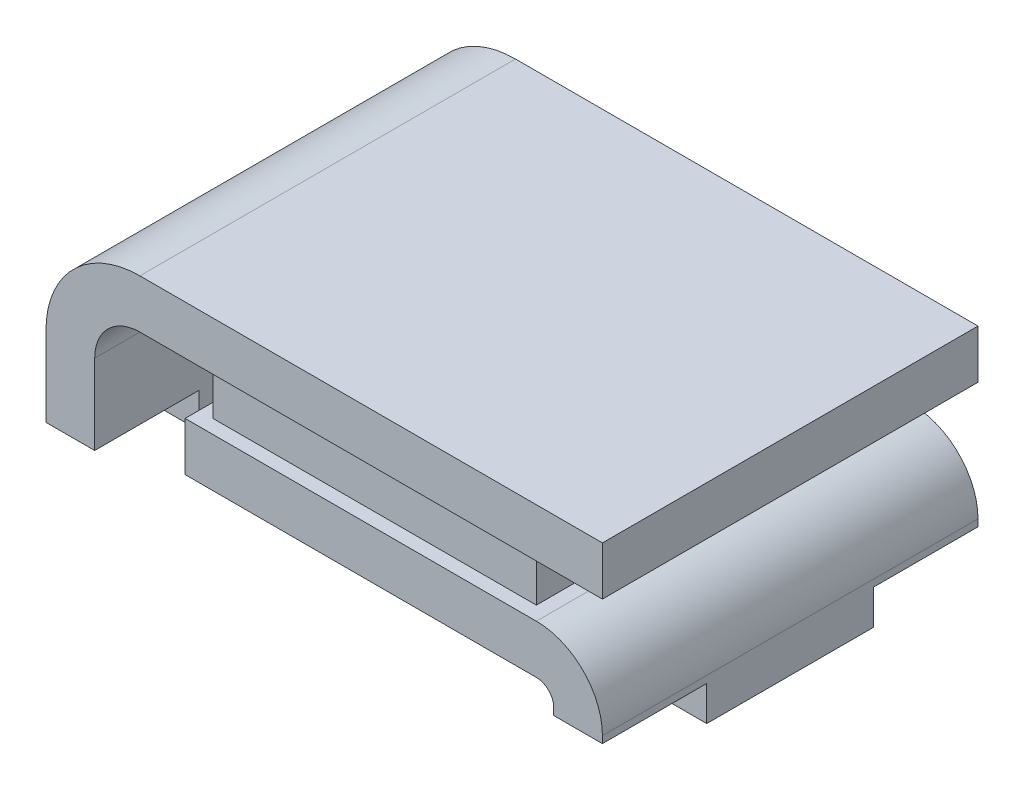
ISO-10303-21;
HEADER;
FILE_DESCRIPTION(('STEP AP214'),'2;1');
FILE_NAME('part.step','',(''),(''),'','','');
FILE_SCHEMA(('AUTOMOTIVE_DESIGN { 1 0 10303 214 1 1 1 1 }'));
ENDSEC;
DATA;
#1=APPLICATION_CONTEXT('core data for automotive mechanical design processes');
#2=APPLICATION_PROTOCOL_DEFINITION('international standard','automotive_design',2000,#1);
#3=PRODUCT_CONTEXT('',#1,'mechanical');
#4=PRODUCT('Part','Part','',(#3));
#5=PRODUCT_RELATED_PRODUCT_CATEGORY('part','',(#4));
#6=PRODUCT_DEFINITION_FORMATION('','',#4);
#7=PRODUCT_DEFINITION_CONTEXT('part definition',#1,'design');
#8=PRODUCT_DEFINITION('design','',#6,#7);
#9=PRODUCT_DEFINITION_SHAPE('','',#8);
#10=(LENGTH_UNIT() NAMED_UNIT(*) SI_UNIT(.MILLI.,.METRE.));
#11=(NAMED_UNIT(*) PLANE_ANGLE_UNIT() SI_UNIT($,.RADIAN.));
#12=(NAMED_UNIT(*) SI_UNIT($,.STERADIAN.) SOLID_ANGLE_UNIT());
#13=UNCERTAINTY_MEASURE_WITH_UNIT(LENGTH_MEASURE(1.E-05),#10,'distance_accuracy_value','');
#14=(GEOMETRIC_REPRESENTATION_CONTEXT(3) GLOBAL_UNCERTAINTY_ASSIGNED_CONTEXT((#13)) GLOBAL_UNIT_ASSIGNED_CONTEXT((#10,
#11,#12)) REPRESENTATION_CONTEXT('',''));
#15=CARTESIAN_POINT('',(0.,0.,0.));
#16=DIRECTION('',(0.,0.,1.));
#17=DIRECTION('',(1.,0.,0.));
#18=AXIS2_PLACEMENT_3D('',#15,#16,#17);
#19=CARTESIAN_POINT('',(3.3,0.6,2.7));
#20=DIRECTION('',(1.,0.,0.));
#21=DIRECTION('',(0.,0.,-1.));
#22=AXIS2_PLACEMENT_3D('',#19,#20,#21);
#23=PLANE('',#22);
#24=DIRECTION('',(0.,0.,1.));
#25=VECTOR('',#24,1.);
#26=CARTESIAN_POINT('',(3.3,0.5,2.8));
#27=LINE('',#26,#25);
#28=CARTESIAN_POINT('',(3.3,0.5,1.2));
#29=VERTEX_POINT('',#28);
#30=CARTESIAN_POINT('',(3.3,0.5,2.7));
#31=VERTEX_POINT('',#30);
#32=EDGE_CURVE('E256',#29,#31,#27,.T.);
#33=ORIENTED_EDGE('',*,*,#32,.T.);
#34=DIRECTION('',(0.,1.,0.));
#35=VECTOR('',#34,1.);
#36=CARTESIAN_POINT('',(3.3,0.6,2.7));
#37=LINE('',#36,#35);
#38=CARTESIAN_POINT('',(3.3,0.6,2.7));
#39=VERTEX_POINT('',#38);
#40=EDGE_CURVE('E202',#31,#39,#37,.T.);
#41=ORIENTED_EDGE('',*,*,#40,.T.);
#42=DIRECTION('',(0.,0.,1.));
#43=VECTOR('',#42,1.);
#44=CARTESIAN_POINT('',(3.3,0.6,0.));
#45=LINE('',#44,#43);
#46=CARTESIAN_POINT('',(3.3,0.6,-2.7));
#47=VERTEX_POINT('',#46);
#48=EDGE_CURVE('E197',#39,#47,#45,.F.);
#49=ORIENTED_EDGE('',*,*,#48,.T.);
#50=DIRECTION('',(0.,1.,0.));
#51=VECTOR('',#50,1.);
#52=CARTESIAN_POINT('',(3.3,0.6,-2.7));
#53=LINE('',#52,#51);
#54=CARTESIAN_POINT('',(3.3,0.5,-2.7));
#55=VERTEX_POINT('',#54);
#56=EDGE_CURVE('E199',#47,#55,#53,.F.);
#57=ORIENTED_EDGE('',*,*,#56,.T.);
#58=DIRECTION('',(0.,0.,1.));
#59=VECTOR('',#58,1.);
#60=CARTESIAN_POINT('',(3.3,0.5,-1.2));
#61=LINE('',#60,#59);
#62=CARTESIAN_POINT('',(3.3,0.5,-1.2));
#63=VERTEX_POINT('',#62);
#64=EDGE_CURVE('E297',#55,#63,#61,.T.);
#65=ORIENTED_EDGE('',*,*,#64,.T.);
#66=DIRECTION('',(0.,1.,0.));
#67=VECTOR('',#66,1.);
#68=CARTESIAN_POINT('',(3.3,-0.1,-1.2));
#69=LINE('',#68,#67);
#70=CARTESIAN_POINT('',(3.3,0.,-1.2));
#71=VERTEX_POINT('',#70);
#72=EDGE_CURVE('E285',#63,#71,#69,.F.);
#73=ORIENTED_EDGE('',*,*,#72,.T.);
#74=DIRECTION('',(0.,0.,1.));
#75=VECTOR('',#74,1.);
#76=CARTESIAN_POINT('',(3.3,0.,0.));
#77=LINE('',#76,#75);
#78=CARTESIAN_POINT('',(3.3,0.,1.2));
#79=VERTEX_POINT('',#78);
#80=EDGE_CURVE('E276',#71,#79,#77,.T.);
#81=ORIENTED_EDGE('',*,*,#80,.T.);
#82=DIRECTION('',(0.,1.,0.));
#83=VECTOR('',#82,1.);
#84=CARTESIAN_POINT('',(3.3,0.5,1.2));
#85=LINE('',#84,#83);
#86=EDGE_CURVE('E266',#79,#29,#85,.T.);
#87=ORIENTED_EDGE('',*,*,#86,.T.);
#88=EDGE_LOOP('',(#33,#41,#49,#57,#65,#73,#81,#87));
#89=FACE_BOUND('',#88,.T.);
#90=ADVANCED_FACE('F16',(#89),#23,.F.);
#91=CARTESIAN_POINT('',(-4.,0.5,-1.2));
#92=DIRECTION('',(0.,1.,0.));
#93=DIRECTION('',(0.,0.,1.));
#94=AXIS2_PLACEMENT_3D('',#91,#92,#93);
#95=PLANE('',#94);
#96=DIRECTION('',(0.,0.,1.));
#97=VECTOR('',#96,1.);
#98=CARTESIAN_POINT('',(4.,0.5,2.7));
#99=LINE('',#98,#97);
#100=CARTESIAN_POINT('',(4.,0.5,-2.7));
#101=VERTEX_POINT('',#100);
#102=CARTESIAN_POINT('',(4.,0.5,-1.2));
#103=VERTEX_POINT('',#102);
#104=EDGE_CURVE('E239',#101,#103,#99,.T.);
#105=ORIENTED_EDGE('',*,*,#104,.T.);
#106=DIRECTION('',(1.,0.,0.));
#107=VECTOR('',#106,1.);
#108=CARTESIAN_POINT('',(-4.,0.5,-1.2));
#109=LINE('',#108,#107);
#110=EDGE_CURVE('E277',#103,#63,#109,.F.);
#111=ORIENTED_EDGE('',*,*,#110,.T.);
#112=ORIENTED_EDGE('',*,*,#64,.F.);
#113=DIRECTION('',(1.,0.,0.));
#114=VECTOR('',#113,1.);
#115=CARTESIAN_POINT('',(4.,0.5,-2.7));
#116=LINE('',#115,#114);
#117=EDGE_CURVE('E215',#55,#101,#116,.T.);
#118=ORIENTED_EDGE('',*,*,#117,.T.);
#119=EDGE_LOOP('',(#105,#111,#112,#118));
#120=FACE_BOUND('',#119,.T.);
#121=ADVANCED_FACE('F649',(#120),#95,.F.);
#122=CARTESIAN_POINT('',(-4.,-0.1,-1.2));
#123=DIRECTION('',(0.,0.,1.));
#124=DIRECTION('',(1.,0.,0.));
#125=AXIS2_PLACEMENT_3D('',#122,#123,#124);
#126=PLANE('',#125);
#127=DIRECTION('',(0.,1.,0.));
#128=VECTOR('',#127,1.);
#129=CARTESIAN_POINT('',(4.,0.6,-1.2));
#130=LINE('',#129,#128);
#131=CARTESIAN_POINT('',(4.,0.,-1.2));
#132=VERTEX_POINT('',#131);
#133=EDGE_CURVE('E270',#103,#132,#130,.F.);
#134=ORIENTED_EDGE('',*,*,#133,.T.);
#135=DIRECTION('',(1.,0.,0.));
#136=VECTOR('',#135,1.);
#137=CARTESIAN_POINT('',(0.,0.,-1.2));
#138=LINE('',#137,#136);
#139=EDGE_CURVE('E273',#132,#71,#138,.F.);
#140=ORIENTED_EDGE('',*,*,#139,.T.);
#141=ORIENTED_EDGE('',*,*,#72,.F.);
#142=ORIENTED_EDGE('',*,*,#110,.F.);
#143=EDGE_LOOP('',(#134,#140,#141,#142));
#144=FACE_BOUND('',#143,.T.);
#145=ADVANCED_FACE('F646',(#144),#126,.F.);
#146=CARTESIAN_POINT('',(0.,0.,0.));
#147=DIRECTION('',(0.,1.,0.));
#148=DIRECTION('',(0.,0.,1.));
#149=AXIS2_PLACEMENT_3D('',#146,#147,#148);
#150=PLANE('',#149);
#151=DIRECTION('',(-1.,0.,0.));
#152=VECTOR('',#151,1.);
#153=CARTESIAN_POINT('',(-4.,0.,1.2));
#154=LINE('',#153,#152);
#155=CARTESIAN_POINT('',(4.,0.,1.2));
#156=VERTEX_POINT('',#155);
#157=EDGE_CURVE('E263',#156,#79,#154,.T.);
#158=ORIENTED_EDGE('',*,*,#157,.T.);
#159=ORIENTED_EDGE('',*,*,#80,.F.);
#160=ORIENTED_EDGE('',*,*,#139,.F.);
#161=DIRECTION('',(0.,0.,1.));
#162=VECTOR('',#161,1.);
#163=CARTESIAN_POINT('',(4.,0.,2.7));
#164=LINE('',#163,#162);
#165=EDGE_CURVE('E260',#132,#156,#164,.T.);
#166=ORIENTED_EDGE('',*,*,#165,.T.);
#167=EDGE_LOOP('',(#158,#159,#160,#166));
#168=FACE_BOUND('',#167,.T.);
#169=ADVANCED_FACE('F642',(#168),#150,.F.);
#170=CARTESIAN_POINT('',(-4.,0.5,1.2));
#171=DIRECTION('',(0.,0.,-1.));
#172=DIRECTION('',(-1.,0.,0.));
#173=AXIS2_PLACEMENT_3D('',#170,#171,#172);
#174=PLANE('',#173);
#175=DIRECTION('',(0.,1.,0.));
#176=VECTOR('',#175,1.);
#177=CARTESIAN_POINT('',(4.,0.6,1.2));
#178=LINE('',#177,#176);
#179=CARTESIAN_POINT('',(4.,0.5,1.2));
#180=VERTEX_POINT('',#179);
#181=EDGE_CURVE('E230',#156,#180,#178,.T.);
#182=ORIENTED_EDGE('',*,*,#181,.T.);
#183=DIRECTION('',(1.,0.,0.));
#184=VECTOR('',#183,1.);
#185=CARTESIAN_POINT('',(-4.,0.5,1.2));
#186=LINE('',#185,#184);
#187=EDGE_CURVE('E216',#180,#29,#186,.F.);
#188=ORIENTED_EDGE('',*,*,#187,.T.);
#189=ORIENTED_EDGE('',*,*,#86,.F.);
#190=ORIENTED_EDGE('',*,*,#157,.F.);
#191=EDGE_LOOP('',(#182,#188,#189,#190));
#192=FACE_BOUND('',#191,.T.);
#193=ADVANCED_FACE('F638',(#192),#174,.F.);
#194=CARTESIAN_POINT('',(-4.,0.5,2.8));
#195=DIRECTION('',(0.,1.,0.));
#196=DIRECTION('',(0.,0.,1.));
#197=AXIS2_PLACEMENT_3D('',#194,#195,#196);
#198=PLANE('',#197);
#199=DIRECTION('',(0.,0.,1.));
#200=VECTOR('',#199,1.);
#201=CARTESIAN_POINT('',(4.,0.5,2.7));
#202=LINE('',#201,#200);
#203=CARTESIAN_POINT('',(4.,0.5,2.7));
#204=VERTEX_POINT('',#203);
#205=EDGE_CURVE('E224',#180,#204,#202,.T.);
#206=ORIENTED_EDGE('',*,*,#205,.T.);
#207=DIRECTION('',(-1.,0.,0.));
#208=VECTOR('',#207,1.);
#209=CARTESIAN_POINT('',(4.,0.5,2.7));
#210=LINE('',#209,#208);
#211=EDGE_CURVE('E243',#204,#31,#210,.T.);
#212=ORIENTED_EDGE('',*,*,#211,.T.);
#213=ORIENTED_EDGE('',*,*,#32,.F.);
#214=ORIENTED_EDGE('',*,*,#187,.F.);
#215=EDGE_LOOP('',(#206,#212,#213,#214));
#216=FACE_BOUND('',#215,.T.);
#217=ADVANCED_FACE('F635',(#216),#198,.F.);
#218=CARTESIAN_POINT('',(3.05,0.6,0.));
#219=DIRECTION('',(0.,0.,1.));
#220=DIRECTION('',(1.,0.,0.));
#221=AXIS2_PLACEMENT_3D('',#218,#219,#220);
#222=CYLINDRICAL_SURFACE('',#221,0.25);
#223=DIRECTION('',(0.,0.,1.));
#224=VECTOR('',#223,1.);
#225=CARTESIAN_POINT('',(3.05,0.85,2.7));
#226=LINE('',#225,#224);
#227=CARTESIAN_POINT('',(3.05,0.85,-2.7));
#228=VERTEX_POINT('',#227);
#229=CARTESIAN_POINT('',(3.05,0.85,2.7));
#230=VERTEX_POINT('',#229);
#231=EDGE_CURVE('E221',#228,#230,#226,.T.);
#232=ORIENTED_EDGE('',*,*,#231,.F.);
#233=CARTESIAN_POINT('',(3.05,0.6,-2.7));
#234=DIRECTION('',(0.,0.,1.));
#235=DIRECTION('',(1.,0.,0.));
#236=AXIS2_PLACEMENT_3D('',#233,#234,#235);
#237=CIRCLE('',#236,0.25);
#238=EDGE_CURVE('E19',#47,#228,#237,.T.);
#239=ORIENTED_EDGE('',*,*,#238,.F.);
#240=ORIENTED_EDGE('',*,*,#48,.F.);
#241=CARTESIAN_POINT('',(3.05,0.6,2.7));
#242=DIRECTION('',(0.,0.,1.));
#243=DIRECTION('',(1.,0.,0.));
#244=AXIS2_PLACEMENT_3D('',#241,#242,#243);
#245=CIRCLE('',#244,0.25);
#246=EDGE_CURVE('E222',#230,#39,#245,.F.);
#247=ORIENTED_EDGE('',*,*,#246,.F.);
#248=EDGE_LOOP('',(#232,#239,#240,#247));
#249=FACE_BOUND('',#248,.T.);
#250=ADVANCED_FACE('F219',(#249),#222,.F.);
#251=CARTESIAN_POINT('',(4.,0.6,2.7));
#252=DIRECTION('',(-1.,0.,0.));
#253=DIRECTION('',(0.,0.,1.));
#254=AXIS2_PLACEMENT_3D('',#251,#252,#253);
#255=PLANE('',#254);
#256=ORIENTED_EDGE('',*,*,#205,.F.);
#257=ORIENTED_EDGE('',*,*,#181,.F.);
#258=ORIENTED_EDGE('',*,*,#165,.F.);
#259=ORIENTED_EDGE('',*,*,#133,.F.);
#260=ORIENTED_EDGE('',*,*,#104,.F.);
#261=DIRECTION('',(0.,1.,0.));
#262=VECTOR('',#261,1.);
#263=CARTESIAN_POINT('',(4.,0.6,-2.7));
#264=LINE('',#263,#262);
#265=CARTESIAN_POINT('',(4.,0.6,-2.7));
#266=VERTEX_POINT('',#265);
#267=EDGE_CURVE('E206',#266,#101,#264,.F.);
#268=ORIENTED_EDGE('',*,*,#267,.F.);
#269=DIRECTION('',(0.,0.,1.));
#270=VECTOR('',#269,1.);
#271=CARTESIAN_POINT('',(4.,0.6,0.));
#272=LINE('',#271,#270);
#273=CARTESIAN_POINT('',(4.,0.6,2.7));
#274=VERTEX_POINT('',#273);
#275=EDGE_CURVE('E234',#274,#266,#272,.F.);
#276=ORIENTED_EDGE('',*,*,#275,.F.);
#277=DIRECTION('',(0.,1.,0.));
#278=VECTOR('',#277,1.);
#279=CARTESIAN_POINT('',(4.,0.6,2.7));
#280=LINE('',#279,#278);
#281=EDGE_CURVE('E223',#204,#274,#280,.T.);
#282=ORIENTED_EDGE('',*,*,#281,.F.);
#283=EDGE_LOOP('',(#256,#257,#258,#259,#260,#268,#276,#282));
#284=FACE_BOUND('',#283,.T.);
#285=ADVANCED_FACE('F626',(#284),#255,.F.);
#286=CARTESIAN_POINT('',(3.05,0.85,2.7));
#287=DIRECTION('',(0.,-1.,0.));
#288=DIRECTION('',(1.,0.,0.));
#289=AXIS2_PLACEMENT_3D('',#286,#287,#288);
#290=PLANE('',#289);
#291=DIRECTION('',(0.,0.,1.));
#292=VECTOR('',#291,1.);
#293=CARTESIAN_POINT('',(-2.00000000000005,0.85,0.));
#294=LINE('',#293,#292);
#295=CARTESIAN_POINT('',(-2.00000000000001,0.85,-2.7));
#296=VERTEX_POINT('',#295);
#297=CARTESIAN_POINT('',(-2.00000000000002,0.85,2.7));
#298=VERTEX_POINT('',#297);
#299=EDGE_CURVE('E341',#296,#298,#294,.T.);
#300=ORIENTED_EDGE('',*,*,#299,.F.);
#301=DIRECTION('',(1.,0.,0.));
#302=VECTOR('',#301,1.);
#303=CARTESIAN_POINT('',(3.05,0.85,-2.7));
#304=LINE('',#303,#302);
#305=EDGE_CURVE('E328',#228,#296,#304,.F.);
#306=ORIENTED_EDGE('',*,*,#305,.F.);
#307=ORIENTED_EDGE('',*,*,#231,.T.);
#308=DIRECTION('',(1.,0.,0.));
#309=VECTOR('',#308,1.);
#310=CARTESIAN_POINT('',(3.05,0.85,2.7));
#311=LINE('',#310,#309);
#312=EDGE_CURVE('E343',#298,#230,#311,.T.);
#313=ORIENTED_EDGE('',*,*,#312,.F.);
#314=EDGE_LOOP('',(#300,#306,#307,#313));
#315=FACE_BOUND('',#314,.T.);
#316=ADVANCED_FACE('F619',(#315),#290,.T.);
#317=CARTESIAN_POINT('',(3.05,0.6,0.));
#318=DIRECTION('',(0.,0.,1.));
#319=DIRECTION('',(1.,0.,0.));
#320=AXIS2_PLACEMENT_3D('',#317,#318,#319);
#321=CYLINDRICAL_SURFACE('',#320,0.95);
#322=DIRECTION('',(0.,0.,1.));
#323=VECTOR('',#322,1.);
#324=CARTESIAN_POINT('',(3.05,1.55,2.7));
#325=LINE('',#324,#323);
#326=CARTESIAN_POINT('',(3.05,1.55,2.7));
#327=VERTEX_POINT('',#326);
#328=CARTESIAN_POINT('',(3.05,1.55,-2.7));
#329=VERTEX_POINT('',#328);
#330=EDGE_CURVE('E345',#327,#329,#325,.F.);
#331=ORIENTED_EDGE('',*,*,#330,.F.);
#332=CARTESIAN_POINT('',(3.05,0.6,2.7));
#333=DIRECTION('',(0.,0.,1.));
#334=DIRECTION('',(1.,0.,0.));
#335=AXIS2_PLACEMENT_3D('',#332,#333,#334);
#336=CIRCLE('',#335,0.95);
#337=EDGE_CURVE('E325',#327,#274,#336,.F.);
#338=ORIENTED_EDGE('',*,*,#337,.T.);
#339=ORIENTED_EDGE('',*,*,#275,.T.);
#340=CARTESIAN_POINT('',(3.05,0.6,-2.7));
#341=DIRECTION('',(0.,0.,1.));
#342=DIRECTION('',(1.,0.,0.));
#343=AXIS2_PLACEMENT_3D('',#340,#341,#342);
#344=CIRCLE('',#343,0.95);
#345=EDGE_CURVE('E329',#266,#329,#344,.T.);
#346=ORIENTED_EDGE('',*,*,#345,.T.);
#347=EDGE_LOOP('',(#331,#338,#339,#346));
#348=FACE_BOUND('',#347,.T.);
#349=ADVANCED_FACE('F617',(#348),#321,.T.);
#350=CARTESIAN_POINT('',(3.05,1.55,-2.7));
#351=DIRECTION('',(0.,0.,-1.));
#352=DIRECTION('',(0.,1.,0.));
#353=AXIS2_PLACEMENT_3D('',#350,#351,#352);
#354=PLANE('',#353);
#355=DIRECTION('',(0.,-1.,0.));
#356=VECTOR('',#355,1.);
#357=CARTESIAN_POINT('',(-2.,-2.45,-2.7));
#358=LINE('',#357,#356);
#359=CARTESIAN_POINT('',(-2.00000000000001,1.55,-2.7));
#360=VERTEX_POINT('',#359);
#361=EDGE_CURVE('E357',#360,#296,#358,.T.);
#362=ORIENTED_EDGE('',*,*,#361,.F.);
#363=DIRECTION('',(-1.,0.,0.));
#364=VECTOR('',#363,1.);
#365=CARTESIAN_POINT('',(3.05,1.55,-2.7));
#366=LINE('',#365,#364);
#367=EDGE_CURVE('E349',#329,#360,#366,.T.);
#368=ORIENTED_EDGE('',*,*,#367,.F.);
#369=ORIENTED_EDGE('',*,*,#345,.F.);
#370=ORIENTED_EDGE('',*,*,#267,.T.);
#371=ORIENTED_EDGE('',*,*,#117,.F.);
#372=ORIENTED_EDGE('',*,*,#56,.F.);
#373=ORIENTED_EDGE('',*,*,#238,.T.);
#374=ORIENTED_EDGE('',*,*,#305,.T.);
#375=EDGE_LOOP('',(#362,#368,#369,#370,#371,#372,#373,#374));
#376=FACE_BOUND('',#375,.T.);
#377=ADVANCED_FACE('F211',(#376),#354,.T.);
#378=CARTESIAN_POINT('',(-2.,-2.45,0.));
#379=DIRECTION('',(-1.,0.,0.));
#380=DIRECTION('',(0.,-1.,0.));
#381=AXIS2_PLACEMENT_3D('',#378,#379,#380);
#382=PLANE('',#381);
#383=DIRECTION('',(0.,0.,1.));
#384=VECTOR('',#383,1.);
#385=CARTESIAN_POINT('',(-2.,1.55,2.7));
#386=LINE('',#385,#384);
#387=CARTESIAN_POINT('',(-2.00000000000003,1.55,2.7));
#388=VERTEX_POINT('',#387);
#389=EDGE_CURVE('E354',#360,#388,#386,.T.);
#390=ORIENTED_EDGE('',*,*,#389,.F.);
#391=ORIENTED_EDGE('',*,*,#361,.T.);
#392=ORIENTED_EDGE('',*,*,#299,.T.);
#393=DIRECTION('',(0.,1.,0.));
#394=VECTOR('',#393,1.);
#395=CARTESIAN_POINT('',(-2.,1.55,2.7));
#396=LINE('',#395,#394);
#397=EDGE_CURVE('E346',#388,#298,#396,.F.);
#398=ORIENTED_EDGE('',*,*,#397,.F.);
#399=EDGE_LOOP('',(#390,#391,#392,#398));
#400=FACE_BOUND('',#399,.T.);
#401=ADVANCED_FACE('F615',(#400),#382,.T.);
#402=CARTESIAN_POINT('',(3.05,1.55,2.7));
#403=DIRECTION('',(0.,0.,1.));
#404=DIRECTION('',(1.,0.,0.));
#405=AXIS2_PLACEMENT_3D('',#402,#403,#404);
#406=PLANE('',#405);
#407=ORIENTED_EDGE('',*,*,#397,.T.);
#408=ORIENTED_EDGE('',*,*,#312,.T.);
#409=ORIENTED_EDGE('',*,*,#246,.T.);
#410=ORIENTED_EDGE('',*,*,#40,.F.);
#411=ORIENTED_EDGE('',*,*,#211,.F.);
#412=ORIENTED_EDGE('',*,*,#281,.T.);
#413=ORIENTED_EDGE('',*,*,#337,.F.);
#414=DIRECTION('',(-1.,0.,0.));
#415=VECTOR('',#414,1.);
#416=CARTESIAN_POINT('',(3.05,1.55,2.7));
#417=LINE('',#416,#415);
#418=EDGE_CURVE('E350',#388,#327,#417,.F.);
#419=ORIENTED_EDGE('',*,*,#418,.F.);
#420=EDGE_LOOP('',(#407,#408,#409,#410,#411,#412,#413,#419));
#421=FACE_BOUND('',#420,.T.);
#422=ADVANCED_FACE('F616',(#421),#406,.T.);
#423=CARTESIAN_POINT('',(-3.3,1.65,2.7));
#424=DIRECTION('',(-1.,0.,0.));
#425=DIRECTION('',(0.,0.,1.));
#426=AXIS2_PLACEMENT_3D('',#423,#424,#425);
#427=PLANE('',#426);
#428=DIRECTION('',(0.,0.,1.));
#429=VECTOR('',#428,1.);
#430=CARTESIAN_POINT('',(-3.3,0.5,2.8));
#431=LINE('',#430,#429);
#432=CARTESIAN_POINT('',(-3.3,0.5,2.7));
#433=VERTEX_POINT('',#432);
#434=CARTESIAN_POINT('',(-3.3,0.5,1.2));
#435=VERTEX_POINT('',#434);
#436=EDGE_CURVE('E379',#433,#435,#431,.F.);
#437=ORIENTED_EDGE('',*,*,#436,.T.);
#438=DIRECTION('',(0.,1.,0.));
#439=VECTOR('',#438,1.);
#440=CARTESIAN_POINT('',(-3.3,0.5,1.2));
#441=LINE('',#440,#439);
#442=CARTESIAN_POINT('',(-3.3,0.,1.2));
#443=VERTEX_POINT('',#442);
#444=EDGE_CURVE('E377',#435,#443,#441,.F.);
#445=ORIENTED_EDGE('',*,*,#444,.T.);
#446=DIRECTION('',(0.,0.,1.));
#447=VECTOR('',#446,1.);
#448=CARTESIAN_POINT('',(-3.3,0.,0.));
#449=LINE('',#448,#447);
#450=CARTESIAN_POINT('',(-3.3,0.,-1.2));
#451=VERTEX_POINT('',#450);
#452=EDGE_CURVE('E353',#443,#451,#449,.F.);
#453=ORIENTED_EDGE('',*,*,#452,.T.);
#454=DIRECTION('',(0.,1.,0.));
#455=VECTOR('',#454,1.);
#456=CARTESIAN_POINT('',(-3.3,-0.1,-1.2));
#457=LINE('',#456,#455);
#458=CARTESIAN_POINT('',(-3.3,0.5,-1.2));
#459=VERTEX_POINT('',#458);
#460=EDGE_CURVE('E365',#451,#459,#457,.T.);
#461=ORIENTED_EDGE('',*,*,#460,.T.);
#462=DIRECTION('',(0.,0.,1.));
#463=VECTOR('',#462,1.);
#464=CARTESIAN_POINT('',(-3.3,0.5,-1.2));
#465=LINE('',#464,#463);
#466=CARTESIAN_POINT('',(-3.3,0.5,-2.7));
#467=VERTEX_POINT('',#466);
#468=EDGE_CURVE('E389',#459,#467,#465,.F.);
#469=ORIENTED_EDGE('',*,*,#468,.T.);
#470=DIRECTION('',(0.,1.,0.));
#471=VECTOR('',#470,1.);
#472=CARTESIAN_POINT('',(-3.3,1.65,-2.7));
#473=LINE('',#472,#471);
#474=CARTESIAN_POINT('',(-3.3,1.65,-2.7));
#475=VERTEX_POINT('',#474);
#476=EDGE_CURVE('E428',#467,#475,#473,.T.);
#477=ORIENTED_EDGE('',*,*,#476,.T.);
#478=DIRECTION('',(0.,0.,-1.));
#479=VECTOR('',#478,1.);
#480=CARTESIAN_POINT('',(-3.3,1.65,0.));
#481=LINE('',#480,#479);
#482=CARTESIAN_POINT('',(-3.3,1.65,2.7));
#483=VERTEX_POINT('',#482);
#484=EDGE_CURVE('E445',#475,#483,#481,.F.);
#485=ORIENTED_EDGE('',*,*,#484,.T.);
#486=DIRECTION('',(0.,1.,0.));
#487=VECTOR('',#486,1.);
#488=CARTESIAN_POINT('',(-3.3,1.65,2.7));
#489=LINE('',#488,#487);
#490=EDGE_CURVE('E373',#483,#433,#489,.F.);
#491=ORIENTED_EDGE('',*,*,#490,.T.);
#492=EDGE_LOOP('',(#437,#445,#453,#461,#469,#477,#485,#491));
#493=FACE_BOUND('',#492,.T.);
#494=ADVANCED_FACE('F539',(#493),#427,.F.);
#495=CARTESIAN_POINT('',(3.05,1.55,2.7));
#496=DIRECTION('',(0.,1.,0.));
#497=DIRECTION('',(-1.,0.,0.));
#498=AXIS2_PLACEMENT_3D('',#495,#496,#497);
#499=PLANE('',#498);
#500=DIRECTION('',(1.,0.,0.));
#501=VECTOR('',#500,1.);
#502=CARTESIAN_POINT('',(-1.8,1.55,-2.5));
#503=LINE('',#502,#501);
#504=CARTESIAN_POINT('',(-1.8,1.55,-2.5));
#505=VERTEX_POINT('',#504);
#506=CARTESIAN_POINT('',(2.85,1.55,-2.5));
#507=VERTEX_POINT('',#506);
#508=EDGE_CURVE('E464',#505,#507,#503,.T.);
#509=ORIENTED_EDGE('',*,*,#508,.T.);
#510=DIRECTION('',(0.,0.,1.));
#511=VECTOR('',#510,1.);
#512=CARTESIAN_POINT('',(2.85,1.55,-2.5));
#513=LINE('',#512,#511);
#514=CARTESIAN_POINT('',(2.85,1.55,2.5));
#515=VERTEX_POINT('',#514);
#516=EDGE_CURVE('E460',#507,#515,#513,.T.);
#517=ORIENTED_EDGE('',*,*,#516,.T.);
#518=DIRECTION('',(-1.,0.,0.));
#519=VECTOR('',#518,1.);
#520=CARTESIAN_POINT('',(-1.8,1.55,2.5));
#521=LINE('',#520,#519);
#522=CARTESIAN_POINT('',(-1.8,1.55,2.5));
#523=VERTEX_POINT('',#522);
#524=EDGE_CURVE('E456',#515,#523,#521,.T.);
#525=ORIENTED_EDGE('',*,*,#524,.T.);
#526=DIRECTION('',(0.,0.,-1.));
#527=VECTOR('',#526,1.);
#528=CARTESIAN_POINT('',(-1.8,1.55,-2.5));
#529=LINE('',#528,#527);
#530=EDGE_CURVE('E447',#523,#505,#529,.T.);
#531=ORIENTED_EDGE('',*,*,#530,.T.);
#532=EDGE_LOOP('',(#509,#517,#525,#531));
#533=FACE_BOUND('',#532,.T.);
#534=ORIENTED_EDGE('',*,*,#389,.T.);
#535=ORIENTED_EDGE('',*,*,#418,.T.);
#536=ORIENTED_EDGE('',*,*,#330,.T.);
#537=ORIENTED_EDGE('',*,*,#367,.T.);
#538=EDGE_LOOP('',(#534,#535,#536,#537));
#539=FACE_BOUND('',#538,.T.);
#540=ADVANCED_FACE('F610',(#533,#539),#499,.T.);
#541=CARTESIAN_POINT('',(0.,0.,0.));
#542=DIRECTION('',(0.,1.,0.));
#543=DIRECTION('',(0.,0.,1.));
#544=AXIS2_PLACEMENT_3D('',#541,#542,#543);
#545=PLANE('',#544);
#546=DIRECTION('',(-1.,0.,0.));
#547=VECTOR('',#546,1.);
#548=CARTESIAN_POINT('',(-4.,0.,1.2));
#549=LINE('',#548,#547);
#550=CARTESIAN_POINT('',(-4.,0.,1.2));
#551=VERTEX_POINT('',#550);
#552=EDGE_CURVE('E374',#443,#551,#549,.T.);
#553=ORIENTED_EDGE('',*,*,#552,.T.);
#554=DIRECTION('',(0.,0.,-1.));
#555=VECTOR('',#554,1.);
#556=CARTESIAN_POINT('',(-4.,0.,2.7));
#557=LINE('',#556,#555);
#558=CARTESIAN_POINT('',(-4.,0.,-1.2));
#559=VERTEX_POINT('',#558);
#560=EDGE_CURVE('E403',#551,#559,#557,.T.);
#561=ORIENTED_EDGE('',*,*,#560,.T.);
#562=DIRECTION('',(1.,0.,0.));
#563=VECTOR('',#562,1.);
#564=CARTESIAN_POINT('',(-4.,0.,-1.2));
#565=LINE('',#564,#563);
#566=EDGE_CURVE('E367',#559,#451,#565,.T.);
#567=ORIENTED_EDGE('',*,*,#566,.T.);
#568=ORIENTED_EDGE('',*,*,#452,.F.);
#569=EDGE_LOOP('',(#553,#561,#567,#568));
#570=FACE_BOUND('',#569,.T.);
#571=ADVANCED_FACE('F541',(#570),#545,.F.);
#572=CARTESIAN_POINT('',(-4.,-0.1,-1.2));
#573=DIRECTION('',(0.,0.,1.));
#574=DIRECTION('',(1.,0.,0.));
#575=AXIS2_PLACEMENT_3D('',#572,#573,#574);
#576=PLANE('',#575);
#577=DIRECTION('',(0.,1.,0.));
#578=VECTOR('',#577,1.);
#579=CARTESIAN_POINT('',(-4.,1.65,-1.2));
#580=LINE('',#579,#578);
#581=CARTESIAN_POINT('',(-4.,0.5,-1.2));
#582=VERTEX_POINT('',#581);
#583=EDGE_CURVE('E405',#559,#582,#580,.T.);
#584=ORIENTED_EDGE('',*,*,#583,.T.);
#585=DIRECTION('',(1.,0.,0.));
#586=VECTOR('',#585,1.);
#587=CARTESIAN_POINT('',(-4.,0.5,-1.2));
#588=LINE('',#587,#586);
#589=EDGE_CURVE('E386',#582,#459,#588,.T.);
#590=ORIENTED_EDGE('',*,*,#589,.T.);
#591=ORIENTED_EDGE('',*,*,#460,.F.);
#592=ORIENTED_EDGE('',*,*,#566,.F.);
#593=EDGE_LOOP('',(#584,#590,#591,#592));
#594=FACE_BOUND('',#593,.T.);
#595=ADVANCED_FACE('F546',(#594),#576,.F.);
#596=CARTESIAN_POINT('',(-4.,0.5,-1.2));
#597=DIRECTION('',(0.,1.,0.));
#598=DIRECTION('',(0.,0.,1.));
#599=AXIS2_PLACEMENT_3D('',#596,#597,#598);
#600=PLANE('',#599);
#601=DIRECTION('',(0.,0.,-1.));
#602=VECTOR('',#601,1.);
#603=CARTESIAN_POINT('',(-4.,0.5,2.7));
#604=LINE('',#603,#602);
#605=CARTESIAN_POINT('',(-4.,0.5,-2.7));
#606=VERTEX_POINT('',#605);
#607=EDGE_CURVE('E414',#582,#606,#604,.T.);
#608=ORIENTED_EDGE('',*,*,#607,.T.);
#609=DIRECTION('',(1.,0.,0.));
#610=VECTOR('',#609,1.);
#611=CARTESIAN_POINT('',(-3.3,0.5,-2.7));
#612=LINE('',#611,#610);
#613=EDGE_CURVE('E425',#606,#467,#612,.T.);
#614=ORIENTED_EDGE('',*,*,#613,.T.);
#615=ORIENTED_EDGE('',*,*,#468,.F.);
#616=ORIENTED_EDGE('',*,*,#589,.F.);
#617=EDGE_LOOP('',(#608,#614,#615,#616));
#618=FACE_BOUND('',#617,.T.);
#619=ADVANCED_FACE('F552',(#618),#600,.F.);
#620=CARTESIAN_POINT('',(-4.,0.5,2.8));
#621=DIRECTION('',(0.,1.,0.));
#622=DIRECTION('',(0.,0.,1.));
#623=AXIS2_PLACEMENT_3D('',#620,#621,#622);
#624=PLANE('',#623);
#625=DIRECTION('',(-1.,0.,0.));
#626=VECTOR('',#625,1.);
#627=CARTESIAN_POINT('',(-4.,0.5,1.2));
#628=LINE('',#627,#626);
#629=CARTESIAN_POINT('',(-4.,0.5,1.2));
#630=VERTEX_POINT('',#629);
#631=EDGE_CURVE('E370',#630,#435,#628,.F.);
#632=ORIENTED_EDGE('',*,*,#631,.T.);
#633=ORIENTED_EDGE('',*,*,#436,.F.);
#634=DIRECTION('',(-1.,0.,0.));
#635=VECTOR('',#634,1.);
#636=CARTESIAN_POINT('',(-3.3,0.5,2.7));
#637=LINE('',#636,#635);
#638=CARTESIAN_POINT('',(-4.,0.5,2.7));
#639=VERTEX_POINT('',#638);
#640=EDGE_CURVE('E429',#433,#639,#637,.T.);
#641=ORIENTED_EDGE('',*,*,#640,.T.);
#642=DIRECTION('',(0.,0.,-1.));
#643=VECTOR('',#642,1.);
#644=CARTESIAN_POINT('',(-4.,0.5,2.7));
#645=LINE('',#644,#643);
#646=EDGE_CURVE('E400',#639,#630,#645,.T.);
#647=ORIENTED_EDGE('',*,*,#646,.T.);
#648=EDGE_LOOP('',(#632,#633,#641,#647));
#649=FACE_BOUND('',#648,.T.);
#650=ADVANCED_FACE('F531',(#649),#624,.F.);
#651=CARTESIAN_POINT('',(-4.,0.5,1.2));
#652=DIRECTION('',(0.,0.,-1.));
#653=DIRECTION('',(-1.,0.,0.));
#654=AXIS2_PLACEMENT_3D('',#651,#652,#653);
#655=PLANE('',#654);
#656=DIRECTION('',(0.,1.,0.));
#657=VECTOR('',#656,1.);
#658=CARTESIAN_POINT('',(-4.,1.65,1.2));
#659=LINE('',#658,#657);
#660=EDGE_CURVE('E324',#630,#551,#659,.F.);
#661=ORIENTED_EDGE('',*,*,#660,.T.);
#662=ORIENTED_EDGE('',*,*,#552,.F.);
#663=ORIENTED_EDGE('',*,*,#444,.F.);
#664=ORIENTED_EDGE('',*,*,#631,.F.);
#665=EDGE_LOOP('',(#661,#662,#663,#664));
#666=FACE_BOUND('',#665,.T.);
#667=ADVANCED_FACE('F535',(#666),#655,.F.);
#668=CARTESIAN_POINT('',(-2.65,1.65,0.));
#669=DIRECTION('',(0.,0.,-1.));
#670=DIRECTION('',(-1.,0.,0.));
#671=AXIS2_PLACEMENT_3D('',#668,#669,#670);
#672=CYLINDRICAL_SURFACE('',#671,0.65);
#673=DIRECTION('',(0.,0.,-1.));
#674=VECTOR('',#673,1.);
#675=CARTESIAN_POINT('',(-2.65,2.3,2.7));
#676=LINE('',#675,#674);
#677=CARTESIAN_POINT('',(-2.65,2.3,2.7));
#678=VERTEX_POINT('',#677);
#679=CARTESIAN_POINT('',(-2.65,2.3,-2.7));
#680=VERTEX_POINT('',#679);
#681=EDGE_CURVE('E320',#678,#680,#676,.T.);
#682=ORIENTED_EDGE('',*,*,#681,.F.);
#683=CARTESIAN_POINT('',(-2.65,1.65,2.7));
#684=DIRECTION('',(0.,0.,-1.));
#685=DIRECTION('',(-1.,0.,0.));
#686=AXIS2_PLACEMENT_3D('',#683,#684,#685);
#687=CIRCLE('',#686,0.65);
#688=EDGE_CURVE('E321',#483,#678,#687,.T.);
#689=ORIENTED_EDGE('',*,*,#688,.F.);
#690=ORIENTED_EDGE('',*,*,#484,.F.);
#691=CARTESIAN_POINT('',(-2.65,1.65,-2.7));
#692=DIRECTION('',(0.,0.,-1.));
#693=DIRECTION('',(-1.,0.,0.));
#694=AXIS2_PLACEMENT_3D('',#691,#692,#693);
#695=CIRCLE('',#694,0.65);
#696=EDGE_CURVE('E317',#680,#475,#695,.F.);
#697=ORIENTED_EDGE('',*,*,#696,.F.);
#698=EDGE_LOOP('',(#682,#689,#690,#697));
#699=FACE_BOUND('',#698,.T.);
#700=ADVANCED_FACE('F555',(#699),#672,.F.);
#701=CARTESIAN_POINT('',(-1.8,2.55,-2.5));
#702=DIRECTION('',(1.,0.,0.));
#703=DIRECTION('',(0.,0.,-1.));
#704=AXIS2_PLACEMENT_3D('',#701,#702,#703);
#705=PLANE('',#704);
#706=DIRECTION('',(0.,0.,-1.));
#707=VECTOR('',#706,1.);
#708=CARTESIAN_POINT('',(-1.8,2.3,2.7));
#709=LINE('',#708,#707);
#710=CARTESIAN_POINT('',(-1.8,2.3,-2.5));
#711=VERTEX_POINT('',#710);
#712=CARTESIAN_POINT('',(-1.8,2.3,2.5));
#713=VERTEX_POINT('',#712);
#714=EDGE_CURVE('E454',#711,#713,#709,.F.);
#715=ORIENTED_EDGE('',*,*,#714,.F.);
#716=DIRECTION('',(0.,1.,0.));
#717=VECTOR('',#716,1.);
#718=CARTESIAN_POINT('',(-1.8,2.55,-2.5));
#719=LINE('',#718,#717);
#720=EDGE_CURVE('E406',#711,#505,#719,.F.);
#721=ORIENTED_EDGE('',*,*,#720,.T.);
#722=ORIENTED_EDGE('',*,*,#530,.F.);
#723=DIRECTION('',(0.,1.,0.));
#724=VECTOR('',#723,1.);
#725=CARTESIAN_POINT('',(-1.8,2.55,2.5));
#726=LINE('',#725,#724);
#727=EDGE_CURVE('E458',#523,#713,#726,.T.);
#728=ORIENTED_EDGE('',*,*,#727,.T.);
#729=EDGE_LOOP('',(#715,#721,#722,#728));
#730=FACE_BOUND('',#729,.T.);
#731=ADVANCED_FACE('F557',(#730),#705,.F.);
#732=CARTESIAN_POINT('',(-1.8,2.55,2.5));
#733=DIRECTION('',(0.,0.,-1.));
#734=DIRECTION('',(-1.,0.,0.));
#735=AXIS2_PLACEMENT_3D('',#732,#733,#734);
#736=PLANE('',#735);
#737=DIRECTION('',(1.,0.,0.));
#738=VECTOR('',#737,1.);
#739=CARTESIAN_POINT('',(-2.65,2.3,2.5));
#740=LINE('',#739,#738);
#741=CARTESIAN_POINT('',(2.85,2.3,2.5));
#742=VERTEX_POINT('',#741);
#743=EDGE_CURVE('E487',#713,#742,#740,.T.);
#744=ORIENTED_EDGE('',*,*,#743,.F.);
#745=ORIENTED_EDGE('',*,*,#727,.F.);
#746=ORIENTED_EDGE('',*,*,#524,.F.);
#747=DIRECTION('',(0.,-1.,0.));
#748=VECTOR('',#747,1.);
#749=CARTESIAN_POINT('',(2.85,2.55,2.5));
#750=LINE('',#749,#748);
#751=EDGE_CURVE('E462',#515,#742,#750,.F.);
#752=ORIENTED_EDGE('',*,*,#751,.T.);
#753=EDGE_LOOP('',(#744,#745,#746,#752));
#754=FACE_BOUND('',#753,.T.);
#755=ADVANCED_FACE('F564',(#754),#736,.F.);
#756=CARTESIAN_POINT('',(2.85,2.55,-2.5));
#757=DIRECTION('',(-1.,0.,0.));
#758=DIRECTION('',(0.,-1.,0.));
#759=AXIS2_PLACEMENT_3D('',#756,#757,#758);
#760=PLANE('',#759);
#761=DIRECTION('',(0.,0.,-1.));
#762=VECTOR('',#761,1.);
#763=CARTESIAN_POINT('',(2.85,2.3,2.7));
#764=LINE('',#763,#762);
#765=CARTESIAN_POINT('',(2.85,2.3,-2.5));
#766=VERTEX_POINT('',#765);
#767=EDGE_CURVE('E490',#742,#766,#764,.T.);
#768=ORIENTED_EDGE('',*,*,#767,.F.);
#769=ORIENTED_EDGE('',*,*,#751,.F.);
#770=ORIENTED_EDGE('',*,*,#516,.F.);
#771=DIRECTION('',(0.,1.,0.));
#772=VECTOR('',#771,1.);
#773=CARTESIAN_POINT('',(2.85,2.55,-2.5));
#774=LINE('',#773,#772);
#775=EDGE_CURVE('E466',#507,#766,#774,.T.);
#776=ORIENTED_EDGE('',*,*,#775,.T.);
#777=EDGE_LOOP('',(#768,#769,#770,#776));
#778=FACE_BOUND('',#777,.T.);
#779=ADVANCED_FACE('F589',(#778),#760,.F.);
#780=CARTESIAN_POINT('',(-1.8,2.55,-2.5));
#781=DIRECTION('',(0.,0.,1.));
#782=DIRECTION('',(1.,0.,0.));
#783=AXIS2_PLACEMENT_3D('',#780,#781,#782);
#784=PLANE('',#783);
#785=DIRECTION('',(1.,0.,0.));
#786=VECTOR('',#785,1.);
#787=CARTESIAN_POINT('',(-2.65,2.3,-2.5));
#788=LINE('',#787,#786);
#789=EDGE_CURVE('E481',#766,#711,#788,.F.);
#790=ORIENTED_EDGE('',*,*,#789,.F.);
#791=ORIENTED_EDGE('',*,*,#775,.F.);
#792=ORIENTED_EDGE('',*,*,#508,.F.);
#793=ORIENTED_EDGE('',*,*,#720,.F.);
#794=EDGE_LOOP('',(#790,#791,#792,#793));
#795=FACE_BOUND('',#794,.T.);
#796=ADVANCED_FACE('F586',(#795),#784,.F.);
#797=CARTESIAN_POINT('',(-4.,1.65,2.7));
#798=DIRECTION('',(1.,0.,0.));
#799=DIRECTION('',(0.,0.,-1.));
#800=AXIS2_PLACEMENT_3D('',#797,#798,#799);
#801=PLANE('',#800);
#802=ORIENTED_EDGE('',*,*,#646,.F.);
#803=DIRECTION('',(0.,1.,0.));
#804=VECTOR('',#803,1.);
#805=CARTESIAN_POINT('',(-4.,1.65,2.7));
#806=LINE('',#805,#804);
#807=CARTESIAN_POINT('',(-4.,1.65,2.7));
#808=VERTEX_POINT('',#807);
#809=EDGE_CURVE('E433',#808,#639,#806,.F.);
#810=ORIENTED_EDGE('',*,*,#809,.F.);
#811=DIRECTION('',(0.,0.,-1.));
#812=VECTOR('',#811,1.);
#813=CARTESIAN_POINT('',(-4.,1.65,0.));
#814=LINE('',#813,#812);
#815=CARTESIAN_POINT('',(-4.,1.65,-2.7));
#816=VERTEX_POINT('',#815);
#817=EDGE_CURVE('E316',#816,#808,#814,.F.);
#818=ORIENTED_EDGE('',*,*,#817,.F.);
#819=DIRECTION('',(0.,1.,0.));
#820=VECTOR('',#819,1.);
#821=CARTESIAN_POINT('',(-4.,1.65,-2.7));
#822=LINE('',#821,#820);
#823=EDGE_CURVE('E422',#606,#816,#822,.T.);
#824=ORIENTED_EDGE('',*,*,#823,.F.);
#825=ORIENTED_EDGE('',*,*,#607,.F.);
#826=ORIENTED_EDGE('',*,*,#583,.F.);
#827=ORIENTED_EDGE('',*,*,#560,.F.);
#828=ORIENTED_EDGE('',*,*,#660,.F.);
#829=EDGE_LOOP('',(#802,#810,#818,#824,#825,#826,#827,#828));
#830=FACE_BOUND('',#829,.T.);
#831=ADVANCED_FACE('F527',(#830),#801,.F.);
#832=CARTESIAN_POINT('',(-2.65,2.3,2.7));
#833=DIRECTION('',(0.,-1.,0.));
#834=DIRECTION('',(0.,0.,-1.));
#835=AXIS2_PLACEMENT_3D('',#832,#833,#834);
#836=PLANE('',#835);
#837=ORIENTED_EDGE('',*,*,#767,.T.);
#838=ORIENTED_EDGE('',*,*,#789,.T.);
#839=ORIENTED_EDGE('',*,*,#714,.T.);
#840=ORIENTED_EDGE('',*,*,#743,.T.);
#841=EDGE_LOOP('',(#837,#838,#839,#840));
#842=FACE_BOUND('',#841,.T.);
#843=DIRECTION('',(0.,0.,1.));
#844=VECTOR('',#843,1.);
#845=CARTESIAN_POINT('',(4.,2.3,0.));
#846=LINE('',#845,#844);
#847=CARTESIAN_POINT('',(4.,2.3,2.7));
#848=VERTEX_POINT('',#847);
#849=CARTESIAN_POINT('',(4.,2.3,-2.7));
#850=VERTEX_POINT('',#849);
#851=EDGE_CURVE('E497',#848,#850,#846,.F.);
#852=ORIENTED_EDGE('',*,*,#851,.F.);
#853=DIRECTION('',(1.,0.,0.));
#854=VECTOR('',#853,1.);
#855=CARTESIAN_POINT('',(-2.65,2.3,2.7));
#856=LINE('',#855,#854);
#857=EDGE_CURVE('E313',#678,#848,#856,.T.);
#858=ORIENTED_EDGE('',*,*,#857,.F.);
#859=ORIENTED_EDGE('',*,*,#681,.T.);
#860=DIRECTION('',(1.,0.,0.));
#861=VECTOR('',#860,1.);
#862=CARTESIAN_POINT('',(-2.65,2.3,-2.7));
#863=LINE('',#862,#861);
#864=EDGE_CURVE('E448',#850,#680,#863,.F.);
#865=ORIENTED_EDGE('',*,*,#864,.F.);
#866=EDGE_LOOP('',(#852,#858,#859,#865));
#867=FACE_BOUND('',#866,.T.);
#868=ADVANCED_FACE('F514',(#842,#867),#836,.T.);
#869=CARTESIAN_POINT('',(-2.65,1.65,0.));
#870=DIRECTION('',(0.,0.,-1.));
#871=DIRECTION('',(-1.,0.,0.));
#872=AXIS2_PLACEMENT_3D('',#869,#870,#871);
#873=CYLINDRICAL_SURFACE('',#872,1.35);
#874=DIRECTION('',(0.,0.,1.));
#875=VECTOR('',#874,1.);
#876=CARTESIAN_POINT('',(-2.65,3.,2.7));
#877=LINE('',#876,#875);
#878=CARTESIAN_POINT('',(-2.65,3.,-2.7));
#879=VERTEX_POINT('',#878);
#880=CARTESIAN_POINT('',(-2.65,3.,2.7));
#881=VERTEX_POINT('',#880);
#882=EDGE_CURVE('E451',#879,#881,#877,.T.);
#883=ORIENTED_EDGE('',*,*,#882,.F.);
#884=CARTESIAN_POINT('',(-2.65,1.65,-2.7));
#885=DIRECTION('',(0.,0.,-1.));
#886=DIRECTION('',(-1.,0.,0.));
#887=AXIS2_PLACEMENT_3D('',#884,#885,#886);
#888=CIRCLE('',#887,1.35);
#889=EDGE_CURVE('E310',#879,#816,#888,.F.);
#890=ORIENTED_EDGE('',*,*,#889,.T.);
#891=ORIENTED_EDGE('',*,*,#817,.T.);
#892=CARTESIAN_POINT('',(-2.65,1.65,2.7));
#893=DIRECTION('',(0.,0.,-1.));
#894=DIRECTION('',(-1.,0.,0.));
#895=AXIS2_PLACEMENT_3D('',#892,#893,#894);
#896=CIRCLE('',#895,1.35);
#897=EDGE_CURVE('E314',#808,#881,#896,.T.);
#898=ORIENTED_EDGE('',*,*,#897,.T.);
#899=EDGE_LOOP('',(#883,#890,#891,#898));
#900=FACE_BOUND('',#899,.T.);
#901=ADVANCED_FACE('F522',(#900),#873,.T.);
#902=CARTESIAN_POINT('',(-2.65,2.3,2.7));
#903=DIRECTION('',(0.,0.,1.));
#904=DIRECTION('',(0.,-1.,0.));
#905=AXIS2_PLACEMENT_3D('',#902,#903,#904);
#906=PLANE('',#905);
#907=DIRECTION('',(0.,1.,0.));
#908=VECTOR('',#907,1.);
#909=CARTESIAN_POINT('',(4.,-1.,2.7));
#910=LINE('',#909,#908);
#911=CARTESIAN_POINT('',(4.,3.,2.7));
#912=VERTEX_POINT('',#911);
#913=EDGE_CURVE('E441',#912,#848,#910,.F.);
#914=ORIENTED_EDGE('',*,*,#913,.F.);
#915=DIRECTION('',(1.,0.,0.));
#916=VECTOR('',#915,1.);
#917=CARTESIAN_POINT('',(-2.65,3.,2.7));
#918=LINE('',#917,#916);
#919=EDGE_CURVE('E477',#881,#912,#918,.T.);
#920=ORIENTED_EDGE('',*,*,#919,.F.);
#921=ORIENTED_EDGE('',*,*,#897,.F.);
#922=ORIENTED_EDGE('',*,*,#809,.T.);
#923=ORIENTED_EDGE('',*,*,#640,.F.);
#924=ORIENTED_EDGE('',*,*,#490,.F.);
#925=ORIENTED_EDGE('',*,*,#688,.T.);
#926=ORIENTED_EDGE('',*,*,#857,.T.);
#927=EDGE_LOOP('',(#914,#920,#921,#922,#923,#924,#925,#926));
#928=FACE_BOUND('',#927,.T.);
#929=ADVANCED_FACE('F508',(#928),#906,.T.);
#930=CARTESIAN_POINT('',(4.,-1.,0.));
#931=DIRECTION('',(1.,0.,0.));
#932=DIRECTION('',(0.,1.,0.));
#933=AXIS2_PLACEMENT_3D('',#930,#931,#932);
#934=PLANE('',#933);
#935=ORIENTED_EDGE('',*,*,#851,.T.);
#936=DIRECTION('',(0.,1.,0.));
#937=VECTOR('',#936,1.);
#938=CARTESIAN_POINT('',(4.,2.3,-2.7));
#939=LINE('',#938,#937);
#940=CARTESIAN_POINT('',(4.,3.,-2.7));
#941=VERTEX_POINT('',#940);
#942=EDGE_CURVE('E34',#941,#850,#939,.F.);
#943=ORIENTED_EDGE('',*,*,#942,.F.);
#944=DIRECTION('',(0.,0.,1.));
#945=VECTOR('',#944,1.);
#946=CARTESIAN_POINT('',(4.,3.,2.7));
#947=LINE('',#946,#945);
#948=EDGE_CURVE('E25',#912,#941,#947,.F.);
#949=ORIENTED_EDGE('',*,*,#948,.F.);
#950=ORIENTED_EDGE('',*,*,#913,.T.);
#951=EDGE_LOOP('',(#935,#943,#949,#950));
#952=FACE_BOUND('',#951,.T.);
#953=ADVANCED_FACE('F504',(#952),#934,.T.);
#954=CARTESIAN_POINT('',(-2.65,2.3,-2.7));
#955=DIRECTION('',(0.,0.,-1.));
#956=DIRECTION('',(0.,1.,0.));
#957=AXIS2_PLACEMENT_3D('',#954,#955,#956);
#958=PLANE('',#957);
#959=ORIENTED_EDGE('',*,*,#942,.T.);
#960=ORIENTED_EDGE('',*,*,#864,.T.);
#961=ORIENTED_EDGE('',*,*,#696,.T.);
#962=ORIENTED_EDGE('',*,*,#476,.F.);
#963=ORIENTED_EDGE('',*,*,#613,.F.);
#964=ORIENTED_EDGE('',*,*,#823,.T.);
#965=ORIENTED_EDGE('',*,*,#889,.F.);
#966=DIRECTION('',(1.,0.,0.));
#967=VECTOR('',#966,1.);
#968=CARTESIAN_POINT('',(-2.65,3.,-2.7));
#969=LINE('',#968,#967);
#970=EDGE_CURVE('E11',#941,#879,#969,.F.);
#971=ORIENTED_EDGE('',*,*,#970,.F.);
#972=EDGE_LOOP('',(#959,#960,#961,#962,#963,#964,#965,#971));
#973=FACE_BOUND('',#972,.T.);
#974=ADVANCED_FACE('F516',(#973),#958,.T.);
#975=CARTESIAN_POINT('',(-2.65,3.,2.7));
#976=DIRECTION('',(0.,1.,0.));
#977=DIRECTION('',(0.,0.,1.));
#978=AXIS2_PLACEMENT_3D('',#975,#976,#977);
#979=PLANE('',#978);
#980=ORIENTED_EDGE('',*,*,#948,.T.);
#981=ORIENTED_EDGE('',*,*,#970,.T.);
#982=ORIENTED_EDGE('',*,*,#882,.T.);
#983=ORIENTED_EDGE('',*,*,#919,.T.);
#984=EDGE_LOOP('',(#980,#981,#982,#983));
#985=FACE_BOUND('',#984,.T.);
#986=ADVANCED_FACE('F502',(#985),#979,.T.);
#987=CLOSED_SHELL('',(#90,#121,#145,#169,#193,#217,#250,#285,#316,#349,#377,#401,#422,#494,#540,
#571,#595,#619,#650,#667,#700,#731,#755,#779,#796,#831,#868,#901,#929,#953,#974,#986));
#988=MANIFOLD_SOLID_BREP('B1',#987);
#989=ADVANCED_BREP_SHAPE_REPRESENTATION('',(#18,#988),#14);
#990=SHAPE_DEFINITION_REPRESENTATION(#9,#989);
ENDSEC;
END-ISO-10303-21;
